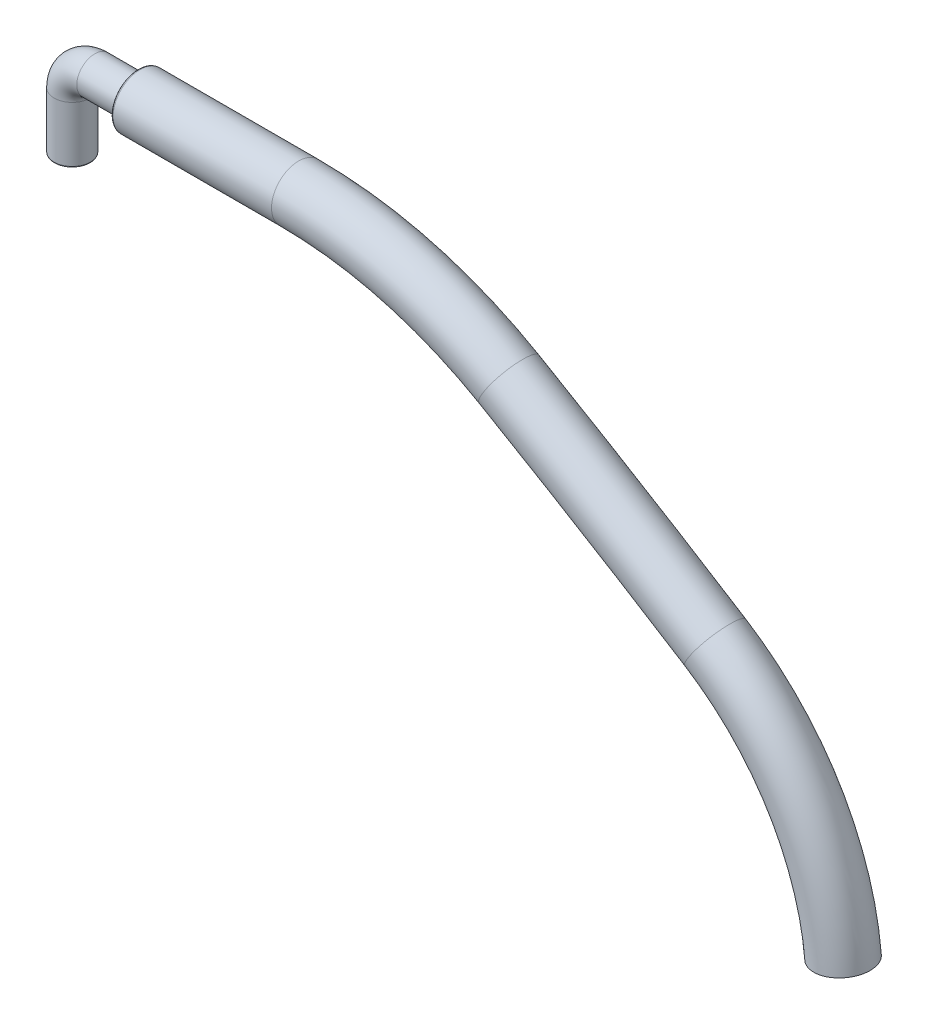
ISO-10303-21;
HEADER;
FILE_DESCRIPTION(('STEP AP214'),'2;1');
FILE_NAME('part.step','',(''),(''),'','','');
FILE_SCHEMA(('AUTOMOTIVE_DESIGN { 1 0 10303 214 1 1 1 1 }'));
ENDSEC;
DATA;
#1=APPLICATION_CONTEXT('core data for automotive mechanical design processes');
#2=APPLICATION_PROTOCOL_DEFINITION('international standard','automotive_design',2000,#1);
#3=PRODUCT_CONTEXT('',#1,'mechanical');
#4=PRODUCT('Part','Part','',(#3));
#5=PRODUCT_RELATED_PRODUCT_CATEGORY('part','',(#4));
#6=PRODUCT_DEFINITION_FORMATION('','',#4);
#7=PRODUCT_DEFINITION_CONTEXT('part definition',#1,'design');
#8=PRODUCT_DEFINITION('design','',#6,#7);
#9=PRODUCT_DEFINITION_SHAPE('','',#8);
#10=(LENGTH_UNIT() NAMED_UNIT(*) SI_UNIT(.MILLI.,.METRE.));
#11=(NAMED_UNIT(*) PLANE_ANGLE_UNIT() SI_UNIT($,.RADIAN.));
#12=(NAMED_UNIT(*) SI_UNIT($,.STERADIAN.) SOLID_ANGLE_UNIT());
#13=UNCERTAINTY_MEASURE_WITH_UNIT(LENGTH_MEASURE(1.E-05),#10,'distance_accuracy_value','');
#14=(GEOMETRIC_REPRESENTATION_CONTEXT(3) GLOBAL_UNCERTAINTY_ASSIGNED_CONTEXT((#13)) GLOBAL_UNIT_ASSIGNED_CONTEXT((#10,
#11,#12)) REPRESENTATION_CONTEXT('',''));
#15=CARTESIAN_POINT('',(0.,0.,0.));
#16=DIRECTION('',(0.,0.,1.));
#17=DIRECTION('',(1.,0.,0.));
#18=AXIS2_PLACEMENT_3D('',#15,#16,#17);
#19=CARTESIAN_POINT('',(218.866247048594,-183.85286055373,0.));
#20=DIRECTION('',(0.,0.,-1.));
#21=DIRECTION('',(-1.,0.,0.));
#22=AXIS2_PLACEMENT_3D('',#19,#20,#21);
#23=TOROIDAL_SURFACE('',#22,122.594141933275,12.);
#24=CARTESIAN_POINT('',(284.383039561643,-80.2339745572182,0.));
#25=DIRECTION('',(0.845218901674018,-0.53442025434387,0.));
#26=DIRECTION('',(0.,0.,-1.));
#27=AXIS2_PLACEMENT_3D('',#24,#25,#26);
#28=CIRCLE('',#27,12.);
#29=CARTESIAN_POINT('',(290.79608261377,-70.09134773713,0.));
#30=VERTEX_POINT('',#29);
#31=EDGE_CURVE('E56',#30,#30,#28,.T.);
#32=CARTESIAN_POINT('',(340.962848699756,-172.819116783204,0.));
#33=DIRECTION('',(0.0900022105177833,-0.995941565606092,0.));
#34=DIRECTION('',(0.,0.,-1.));
#35=AXIS2_PLACEMENT_3D('',#32,#33,#34);
#36=CIRCLE('',#35,12.);
#37=CARTESIAN_POINT('',(352.914147487029,-171.739090256991,0.));
#38=VERTEX_POINT('',#37);
#39=EDGE_CURVE('E52',#38,#38,#36,.T.);
#40=CARTESIAN_POINT('',(218.866247048594,-183.85286055373,0.));
#41=DIRECTION('',(0.,0.,-1.));
#42=DIRECTION('',(-1.,0.,0.));
#43=AXIS2_PLACEMENT_3D('',#40,#41,#42);
#44=CIRCLE('',#43,134.594141933275);
#45=EDGE_CURVE('',#30,#38,#44,.T.);
#46=ORIENTED_EDGE('',*,*,#31,.T.);
#47=ORIENTED_EDGE('',*,*,#39,.F.);
#48=ORIENTED_EDGE('',*,*,#45,.T.);
#49=ORIENTED_EDGE('',*,*,#45,.F.);
#50=EDGE_LOOP('',(#46,#48,#47,#49));
#51=FACE_BOUND('',#50,.T.);
#52=ADVANCED_FACE('F41',(#51),#23,.T.);
#53=CARTESIAN_POINT('',(-1183.22800359876,-2401.35220295904,0.));
#54=DIRECTION('',(0.,0.,-1.));
#55=DIRECTION('',(-1.,0.,0.));
#56=AXIS2_PLACEMENT_3D('',#53,#54,#55);
#57=TOROIDAL_SURFACE('',#56,2746.17406662898,12.);
#58=CARTESIAN_POINT('',(193.106849682031,-24.9737869928195,0.));
#59=DIRECTION('',(0.865341510883649,-0.501182670831309,0.));
#60=DIRECTION('',(0.,0.,-1.));
#61=AXIS2_PLACEMENT_3D('',#58,#59,#60);
#62=CIRCLE('',#61,12.);
#63=CARTESIAN_POINT('',(199.121041732007,-14.5896888622157,0.));
#64=VERTEX_POINT('',#63);
#65=EDGE_CURVE('E61',#64,#64,#62,.T.);
#66=CARTESIAN_POINT('',(-1183.22800359876,-2401.35220295904,0.));
#67=DIRECTION('',(0.,0.,-1.));
#68=DIRECTION('',(-1.,0.,0.));
#69=AXIS2_PLACEMENT_3D('',#66,#67,#68);
#70=CIRCLE('',#69,2758.17406662898);
#71=EDGE_CURVE('',#64,#30,#70,.T.);
#72=ORIENTED_EDGE('',*,*,#65,.T.);
#73=ORIENTED_EDGE('',*,*,#31,.F.);
#74=ORIENTED_EDGE('',*,*,#71,.T.);
#75=ORIENTED_EDGE('',*,*,#71,.F.);
#76=EDGE_LOOP('',(#72,#74,#73,#75));
#77=FACE_BOUND('',#76,.T.);
#78=ADVANCED_FACE('F100',(#77),#57,.T.);
#79=CARTESIAN_POINT('',(100.157423708458,-185.460175267829,0.));
#80=DIRECTION('',(0.,0.,-1.));
#81=DIRECTION('',(-1.,0.,0.));
#82=AXIS2_PLACEMENT_3D('',#79,#80,#81);
#83=TOROIDAL_SURFACE('',#82,185.460175267829,12.);
#84=CARTESIAN_POINT('',(100.157423708458,0.,0.));
#85=DIRECTION('',(1.,0.,0.));
#86=DIRECTION('',(0.,0.,-1.));
#87=AXIS2_PLACEMENT_3D('',#84,#85,#86);
#88=CIRCLE('',#87,12.);
#89=CARTESIAN_POINT('',(100.157423708458,12.,0.));
#90=VERTEX_POINT('',#89);
#91=EDGE_CURVE('E64',#90,#90,#88,.T.);
#92=CARTESIAN_POINT('',(100.157423708458,-185.460175267829,0.));
#93=DIRECTION('',(0.,0.,-1.));
#94=DIRECTION('',(-1.,0.,0.));
#95=AXIS2_PLACEMENT_3D('',#92,#93,#94);
#96=CIRCLE('',#95,197.460175267829);
#97=EDGE_CURVE('',#90,#64,#96,.T.);
#98=ORIENTED_EDGE('',*,*,#91,.T.);
#99=ORIENTED_EDGE('',*,*,#65,.F.);
#100=ORIENTED_EDGE('',*,*,#97,.T.);
#101=ORIENTED_EDGE('',*,*,#97,.F.);
#102=EDGE_LOOP('',(#98,#100,#99,#101));
#103=FACE_BOUND('',#102,.T.);
#104=ADVANCED_FACE('F105',(#103),#83,.T.);
#105=CARTESIAN_POINT('',(100.157423708458,0.,0.));
#106=DIRECTION('',(-1.,0.,0.));
#107=DIRECTION('',(0.,0.,1.));
#108=AXIS2_PLACEMENT_3D('',#105,#106,#107);
#109=CYLINDRICAL_SURFACE('',#108,12.);
#110=CARTESIAN_POINT('',(30.0946378271993,0.,0.));
#111=DIRECTION('',(1.,0.,0.));
#112=DIRECTION('',(0.,0.,-1.));
#113=AXIS2_PLACEMENT_3D('',#110,#111,#112);
#114=CIRCLE('',#113,12.);
#115=CARTESIAN_POINT('',(30.0946378271993,0.,-12.));
#116=VERTEX_POINT('',#115);
#117=EDGE_CURVE('E48',#116,#116,#114,.T.);
#118=ORIENTED_EDGE('',*,*,#117,.T.);
#119=EDGE_LOOP('',(#118));
#120=FACE_BOUND('',#119,.T.);
#121=ORIENTED_EDGE('',*,*,#91,.F.);
#122=EDGE_LOOP('',(#121));
#123=FACE_BOUND('',#122,.T.);
#124=ADVANCED_FACE('F95',(#120,#123),#109,.T.);
#125=CARTESIAN_POINT('',(340.962848699756,-172.819116783204,0.));
#126=DIRECTION('',(0.0900022105177833,-0.995941565606092,0.));
#127=DIRECTION('',(0.,0.,-1.));
#128=AXIS2_PLACEMENT_3D('',#125,#126,#127);
#129=PLANE('',#128);
#130=CARTESIAN_POINT('',(340.962848699756,-172.819116783204,0.));
#131=DIRECTION('',(0.0900022105177833,-0.995941565606092,0.));
#132=DIRECTION('',(0.995941565606092,0.0900022105177833,0.));
#133=AXIS2_PLACEMENT_3D('',#130,#131,#132);
#134=CIRCLE('',#133,8.);
#135=CARTESIAN_POINT('',(348.930381224604,-172.099099099062,0.));
#136=VERTEX_POINT('',#135);
#137=EDGE_CURVE('E67',#136,#136,#134,.T.);
#138=ORIENTED_EDGE('',*,*,#137,.F.);
#139=EDGE_LOOP('',(#138));
#140=FACE_BOUND('',#139,.T.);
#141=ORIENTED_EDGE('',*,*,#39,.T.);
#142=EDGE_LOOP('',(#141));
#143=FACE_BOUND('',#142,.T.);
#144=ADVANCED_FACE('F92',(#140,#143),#129,.T.);
#145=CARTESIAN_POINT('',(29.0946378271993,0.,0.));
#146=DIRECTION('',(1.,0.,0.));
#147=DIRECTION('',(0.,0.,-1.));
#148=AXIS2_PLACEMENT_3D('',#145,#146,#147);
#149=PLANE('',#148);
#150=CARTESIAN_POINT('',(29.0946378271993,0.,0.));
#151=DIRECTION('',(1.,0.,0.));
#152=DIRECTION('',(0.,0.,-1.));
#153=AXIS2_PLACEMENT_3D('',#150,#151,#152);
#154=CIRCLE('',#153,11.);
#155=CARTESIAN_POINT('',(29.0946378271993,0.,-11.));
#156=VERTEX_POINT('',#155);
#157=EDGE_CURVE('E11',#156,#156,#154,.F.);
#158=ORIENTED_EDGE('',*,*,#157,.T.);
#159=EDGE_LOOP('',(#158));
#160=FACE_BOUND('',#159,.T.);
#161=CARTESIAN_POINT('',(29.0946378271993,0.,0.));
#162=DIRECTION('',(1.,0.,0.));
#163=DIRECTION('',(0.,0.,-1.));
#164=AXIS2_PLACEMENT_3D('',#161,#162,#163);
#165=CIRCLE('',#164,8.);
#166=CARTESIAN_POINT('',(29.0946378271993,0.,-8.));
#167=VERTEX_POINT('',#166);
#168=EDGE_CURVE('E68',#167,#167,#165,.T.);
#169=ORIENTED_EDGE('',*,*,#168,.T.);
#170=EDGE_LOOP('',(#169));
#171=FACE_BOUND('',#170,.T.);
#172=ADVANCED_FACE('F88',(#160,#171),#149,.F.);
#173=CARTESIAN_POINT('',(218.866247048594,-183.85286055373,0.));
#174=DIRECTION('',(0.,0.,-1.));
#175=DIRECTION('',(-1.,0.,0.));
#176=AXIS2_PLACEMENT_3D('',#173,#174,#175);
#177=TOROIDAL_SURFACE('',#176,122.594141933275,8.);
#178=CARTESIAN_POINT('',(284.383039561643,-80.2339745572182,0.));
#179=DIRECTION('',(-0.845218901674018,0.534420254343869,0.));
#180=DIRECTION('',(-0.534420254343869,-0.845218901674018,0.));
#181=AXIS2_PLACEMENT_3D('',#178,#179,#180);
#182=CIRCLE('',#181,8.);
#183=CARTESIAN_POINT('',(288.658401596395,-73.472223343826,0.));
#184=VERTEX_POINT('',#183);
#185=EDGE_CURVE('E74',#184,#184,#182,.F.);
#186=CARTESIAN_POINT('',(218.866247048594,-183.85286055373,0.));
#187=DIRECTION('',(0.,0.,-1.));
#188=DIRECTION('',(-1.,0.,0.));
#189=AXIS2_PLACEMENT_3D('',#186,#187,#188);
#190=CIRCLE('',#189,130.594141933275);
#191=EDGE_CURVE('',#184,#136,#190,.T.);
#192=ORIENTED_EDGE('',*,*,#185,.F.);
#193=ORIENTED_EDGE('',*,*,#137,.T.);
#194=ORIENTED_EDGE('',*,*,#191,.T.);
#195=ORIENTED_EDGE('',*,*,#191,.F.);
#196=EDGE_LOOP('',(#192,#194,#193,#195));
#197=FACE_BOUND('',#196,.T.);
#198=ADVANCED_FACE('F85',(#197),#177,.F.);
#199=CARTESIAN_POINT('',(-1183.22800359876,-2401.35220295904,0.));
#200=DIRECTION('',(0.,0.,-1.));
#201=DIRECTION('',(-1.,0.,0.));
#202=AXIS2_PLACEMENT_3D('',#199,#200,#201);
#203=TOROIDAL_SURFACE('',#202,2746.17406662898,8.);
#204=CARTESIAN_POINT('',(193.106849682031,-24.9737869928195,0.));
#205=DIRECTION('',(-0.865341510883649,0.501182670831308,0.));
#206=DIRECTION('',(-0.501182670831308,-0.865341510883649,0.));
#207=AXIS2_PLACEMENT_3D('',#204,#205,#206);
#208=CIRCLE('',#207,8.);
#209=CARTESIAN_POINT('',(197.116311048681,-18.0510549057504,0.));
#210=VERTEX_POINT('',#209);
#211=EDGE_CURVE('E77',#210,#210,#208,.F.);
#212=CARTESIAN_POINT('',(-1183.22800359876,-2401.35220295904,0.));
#213=DIRECTION('',(0.,0.,-1.));
#214=DIRECTION('',(-1.,0.,0.));
#215=AXIS2_PLACEMENT_3D('',#212,#213,#214);
#216=CIRCLE('',#215,2754.17406662898);
#217=EDGE_CURVE('',#210,#184,#216,.T.);
#218=ORIENTED_EDGE('',*,*,#211,.F.);
#219=ORIENTED_EDGE('',*,*,#185,.T.);
#220=ORIENTED_EDGE('',*,*,#217,.T.);
#221=ORIENTED_EDGE('',*,*,#217,.F.);
#222=EDGE_LOOP('',(#218,#220,#219,#221));
#223=FACE_BOUND('',#222,.T.);
#224=ADVANCED_FACE('F83',(#223),#203,.F.);
#225=CARTESIAN_POINT('',(100.157423708458,-185.460175267829,0.));
#226=DIRECTION('',(0.,0.,-1.));
#227=DIRECTION('',(-1.,0.,0.));
#228=AXIS2_PLACEMENT_3D('',#225,#226,#227);
#229=TOROIDAL_SURFACE('',#228,185.460175267829,8.);
#230=CARTESIAN_POINT('',(100.157423708458,0.,0.));
#231=DIRECTION('',(-1.,0.,0.));
#232=DIRECTION('',(0.,-1.,0.));
#233=AXIS2_PLACEMENT_3D('',#230,#231,#232);
#234=CIRCLE('',#233,8.);
#235=CARTESIAN_POINT('',(100.157423708458,7.99999999999998,0.));
#236=VERTEX_POINT('',#235);
#237=EDGE_CURVE('E71',#236,#236,#234,.F.);
#238=CARTESIAN_POINT('',(100.157423708458,-185.460175267829,0.));
#239=DIRECTION('',(0.,0.,-1.));
#240=DIRECTION('',(-1.,0.,0.));
#241=AXIS2_PLACEMENT_3D('',#238,#239,#240);
#242=CIRCLE('',#241,193.460175267829);
#243=EDGE_CURVE('',#236,#210,#242,.T.);
#244=ORIENTED_EDGE('',*,*,#237,.F.);
#245=ORIENTED_EDGE('',*,*,#211,.T.);
#246=ORIENTED_EDGE('',*,*,#243,.T.);
#247=ORIENTED_EDGE('',*,*,#243,.F.);
#248=EDGE_LOOP('',(#244,#246,#245,#247));
#249=FACE_BOUND('',#248,.T.);
#250=ADVANCED_FACE('F119',(#249),#229,.F.);
#251=CARTESIAN_POINT('',(100.157423708458,0.,0.));
#252=DIRECTION('',(-1.,0.,0.));
#253=DIRECTION('',(0.,0.,1.));
#254=AXIS2_PLACEMENT_3D('',#251,#252,#253);
#255=CYLINDRICAL_SURFACE('',#254,8.);
#256=ORIENTED_EDGE('',*,*,#237,.T.);
#257=EDGE_LOOP('',(#256));
#258=FACE_BOUND('',#257,.T.);
#259=ORIENTED_EDGE('',*,*,#168,.F.);
#260=EDGE_LOOP('',(#259));
#261=FACE_BOUND('',#260,.T.);
#262=ADVANCED_FACE('F116',(#258,#261),#255,.F.);
#263=CARTESIAN_POINT('',(30.0946378271993,0.,0.));
#264=DIRECTION('',(1.,0.,0.));
#265=DIRECTION('',(0.,0.,-1.));
#266=AXIS2_PLACEMENT_3D('',#263,#264,#265);
#267=TOROIDAL_SURFACE('',#266,11.,1.);
#268=ORIENTED_EDGE('',*,*,#157,.F.);
#269=EDGE_LOOP('',(#268));
#270=FACE_BOUND('',#269,.T.);
#271=ORIENTED_EDGE('',*,*,#117,.F.);
#272=EDGE_LOOP('',(#271));
#273=FACE_BOUND('',#272,.T.);
#274=ADVANCED_FACE('F43',(#270,#273),#267,.T.);
#275=CLOSED_SHELL('',(#52,#78,#104,#124,#144,#172,#198,#224,#250,#262,#274));
#276=MANIFOLD_SOLID_BREP('B2',#275);
#277=CARTESIAN_POINT('',(10.,0.,0.));
#278=DIRECTION('',(1.,0.,0.));
#279=DIRECTION('',(0.,1.,0.));
#280=AXIS2_PLACEMENT_3D('',#277,#278,#279);
#281=CYLINDRICAL_SURFACE('',#280,8.);
#282=CARTESIAN_POINT('',(49.5,0.,0.));
#283=DIRECTION('',(-1.,0.,0.));
#284=DIRECTION('',(0.,-1.,0.));
#285=AXIS2_PLACEMENT_3D('',#282,#283,#284);
#286=CIRCLE('',#285,8.);
#287=CARTESIAN_POINT('',(49.5,-8.,0.));
#288=VERTEX_POINT('',#287);
#289=EDGE_CURVE('E222',#288,#288,#286,.T.);
#290=ORIENTED_EDGE('',*,*,#289,.T.);
#291=EDGE_LOOP('',(#290));
#292=FACE_BOUND('',#291,.T.);
#293=CARTESIAN_POINT('',(10.,0.,0.));
#294=DIRECTION('',(-1.,0.,0.));
#295=DIRECTION('',(0.,-1.,0.));
#296=AXIS2_PLACEMENT_3D('',#293,#294,#295);
#297=CIRCLE('',#296,8.);
#298=CARTESIAN_POINT('',(10.,8.,0.));
#299=VERTEX_POINT('',#298);
#300=EDGE_CURVE('E239',#299,#299,#297,.T.);
#301=ORIENTED_EDGE('',*,*,#300,.F.);
#302=EDGE_LOOP('',(#301));
#303=FACE_BOUND('',#302,.T.);
#304=ADVANCED_FACE('F207',(#292,#303),#281,.T.);
#305=CARTESIAN_POINT('',(10.,-10.,0.));
#306=DIRECTION('',(0.,0.,-1.));
#307=DIRECTION('',(-1.,0.,0.));
#308=AXIS2_PLACEMENT_3D('',#305,#306,#307);
#309=TOROIDAL_SURFACE('',#308,10.,8.);
#310=CARTESIAN_POINT('',(0.,-10.,0.));
#311=DIRECTION('',(0.,-1.,0.));
#312=DIRECTION('',(1.,0.,0.));
#313=AXIS2_PLACEMENT_3D('',#310,#311,#312);
#314=CIRCLE('',#313,8.);
#315=CARTESIAN_POINT('',(-8.,-10.,0.));
#316=VERTEX_POINT('',#315);
#317=EDGE_CURVE('E242',#316,#316,#314,.T.);
#318=CARTESIAN_POINT('',(10.,-10.,0.));
#319=DIRECTION('',(0.,0.,-1.));
#320=DIRECTION('',(-1.,0.,0.));
#321=AXIS2_PLACEMENT_3D('',#318,#319,#320);
#322=CIRCLE('',#321,18.);
#323=EDGE_CURVE('',#316,#299,#322,.T.);
#324=ORIENTED_EDGE('',*,*,#317,.F.);
#325=ORIENTED_EDGE('',*,*,#300,.T.);
#326=ORIENTED_EDGE('',*,*,#323,.T.);
#327=ORIENTED_EDGE('',*,*,#323,.F.);
#328=EDGE_LOOP('',(#324,#326,#325,#327));
#329=FACE_BOUND('',#328,.T.);
#330=ADVANCED_FACE('F269',(#329),#309,.T.);
#331=CARTESIAN_POINT('',(0.,-10.,0.));
#332=DIRECTION('',(0.,-1.,0.));
#333=DIRECTION('',(1.,0.,0.));
#334=AXIS2_PLACEMENT_3D('',#331,#332,#333);
#335=CYLINDRICAL_SURFACE('',#334,8.);
#336=CARTESIAN_POINT('',(0.,-34.5,0.));
#337=DIRECTION('',(0.,-1.,0.));
#338=DIRECTION('',(1.,0.,0.));
#339=AXIS2_PLACEMENT_3D('',#336,#337,#338);
#340=CIRCLE('',#339,8.);
#341=CARTESIAN_POINT('',(8.,-34.5,0.));
#342=VERTEX_POINT('',#341);
#343=EDGE_CURVE('E227',#342,#342,#340,.F.);
#344=ORIENTED_EDGE('',*,*,#343,.T.);
#345=EDGE_LOOP('',(#344));
#346=FACE_BOUND('',#345,.T.);
#347=ORIENTED_EDGE('',*,*,#317,.T.);
#348=EDGE_LOOP('',(#347));
#349=FACE_BOUND('',#348,.T.);
#350=ADVANCED_FACE('F275',(#346,#349),#335,.T.);
#351=CARTESIAN_POINT('',(50.,0.,0.));
#352=DIRECTION('',(-1.,0.,0.));
#353=DIRECTION('',(0.,-1.,0.));
#354=AXIS2_PLACEMENT_3D('',#351,#352,#353);
#355=PLANE('',#354);
#356=CARTESIAN_POINT('',(50.,0.,0.));
#357=DIRECTION('',(-1.,0.,0.));
#358=DIRECTION('',(0.,-1.,0.));
#359=AXIS2_PLACEMENT_3D('',#356,#357,#358);
#360=CIRCLE('',#359,7.5);
#361=CARTESIAN_POINT('',(50.,-7.5,0.));
#362=VERTEX_POINT('',#361);
#363=EDGE_CURVE('E214',#362,#362,#360,.F.);
#364=ORIENTED_EDGE('',*,*,#363,.T.);
#365=EDGE_LOOP('',(#364));
#366=FACE_BOUND('',#365,.T.);
#367=CARTESIAN_POINT('',(50.,0.,0.));
#368=DIRECTION('',(-1.,0.,0.));
#369=DIRECTION('',(0.,-1.,0.));
#370=AXIS2_PLACEMENT_3D('',#367,#368,#369);
#371=CIRCLE('',#370,6.5);
#372=CARTESIAN_POINT('',(50.,-6.5,0.));
#373=VERTEX_POINT('',#372);
#374=EDGE_CURVE('E218',#373,#373,#371,.T.);
#375=ORIENTED_EDGE('',*,*,#374,.T.);
#376=EDGE_LOOP('',(#375));
#377=FACE_BOUND('',#376,.T.);
#378=ADVANCED_FACE('F301',(#366,#377),#355,.F.);
#379=CARTESIAN_POINT('',(0.,-35.,0.));
#380=DIRECTION('',(0.,-1.,0.));
#381=DIRECTION('',(1.,0.,0.));
#382=AXIS2_PLACEMENT_3D('',#379,#380,#381);
#383=PLANE('',#382);
#384=CARTESIAN_POINT('',(0.,-35.,0.));
#385=DIRECTION('',(0.,-1.,0.));
#386=DIRECTION('',(1.,0.,0.));
#387=AXIS2_PLACEMENT_3D('',#384,#385,#386);
#388=CIRCLE('',#387,6.5);
#389=CARTESIAN_POINT('',(6.5,-35.,0.));
#390=VERTEX_POINT('',#389);
#391=EDGE_CURVE('E230',#390,#390,#388,.F.);
#392=ORIENTED_EDGE('',*,*,#391,.T.);
#393=EDGE_LOOP('',(#392));
#394=FACE_BOUND('',#393,.T.);
#395=CARTESIAN_POINT('',(0.,-35.,0.));
#396=DIRECTION('',(0.,-1.,0.));
#397=DIRECTION('',(1.,0.,0.));
#398=AXIS2_PLACEMENT_3D('',#395,#396,#397);
#399=CIRCLE('',#398,7.5);
#400=CARTESIAN_POINT('',(7.5,-35.,0.));
#401=VERTEX_POINT('',#400);
#402=EDGE_CURVE('E233',#401,#401,#399,.T.);
#403=ORIENTED_EDGE('',*,*,#402,.T.);
#404=EDGE_LOOP('',(#403));
#405=FACE_BOUND('',#404,.T.);
#406=ADVANCED_FACE('F266',(#394,#405),#383,.T.);
#407=CARTESIAN_POINT('',(10.,0.,0.));
#408=DIRECTION('',(1.,0.,0.));
#409=DIRECTION('',(0.,1.,0.));
#410=AXIS2_PLACEMENT_3D('',#407,#408,#409);
#411=CYLINDRICAL_SURFACE('',#410,6.);
#412=CARTESIAN_POINT('',(49.5,0.,0.));
#413=DIRECTION('',(-1.,0.,0.));
#414=DIRECTION('',(0.,-1.,0.));
#415=AXIS2_PLACEMENT_3D('',#412,#413,#414);
#416=CIRCLE('',#415,6.);
#417=CARTESIAN_POINT('',(49.5,-6.,0.));
#418=VERTEX_POINT('',#417);
#419=EDGE_CURVE('E40',#418,#418,#416,.F.);
#420=ORIENTED_EDGE('',*,*,#419,.T.);
#421=EDGE_LOOP('',(#420));
#422=FACE_BOUND('',#421,.T.);
#423=CARTESIAN_POINT('',(10.,0.,0.));
#424=DIRECTION('',(-1.,0.,0.));
#425=DIRECTION('',(0.,-1.,0.));
#426=AXIS2_PLACEMENT_3D('',#423,#424,#425);
#427=CIRCLE('',#426,6.);
#428=CARTESIAN_POINT('',(10.,6.,0.));
#429=VERTEX_POINT('',#428);
#430=EDGE_CURVE('E245',#429,#429,#427,.T.);
#431=ORIENTED_EDGE('',*,*,#430,.T.);
#432=EDGE_LOOP('',(#431));
#433=FACE_BOUND('',#432,.T.);
#434=ADVANCED_FACE('F252',(#422,#433),#411,.F.);
#435=CARTESIAN_POINT('',(10.,-10.,0.));
#436=DIRECTION('',(0.,0.,-1.));
#437=DIRECTION('',(-1.,0.,0.));
#438=AXIS2_PLACEMENT_3D('',#435,#436,#437);
#439=TOROIDAL_SURFACE('',#438,10.,6.);
#440=CARTESIAN_POINT('',(0.,-10.,0.));
#441=DIRECTION('',(0.,-1.,0.));
#442=DIRECTION('',(1.,0.,0.));
#443=AXIS2_PLACEMENT_3D('',#440,#441,#442);
#444=CIRCLE('',#443,6.);
#445=CARTESIAN_POINT('',(-6.,-10.,0.));
#446=VERTEX_POINT('',#445);
#447=EDGE_CURVE('E246',#446,#446,#444,.T.);
#448=CARTESIAN_POINT('',(10.,-10.,0.));
#449=DIRECTION('',(0.,0.,-1.));
#450=DIRECTION('',(-1.,0.,0.));
#451=AXIS2_PLACEMENT_3D('',#448,#449,#450);
#452=CIRCLE('',#451,16.);
#453=EDGE_CURVE('',#446,#429,#452,.T.);
#454=ORIENTED_EDGE('',*,*,#447,.T.);
#455=ORIENTED_EDGE('',*,*,#430,.F.);
#456=ORIENTED_EDGE('',*,*,#453,.T.);
#457=ORIENTED_EDGE('',*,*,#453,.F.);
#458=EDGE_LOOP('',(#454,#456,#455,#457));
#459=FACE_BOUND('',#458,.T.);
#460=ADVANCED_FACE('F254',(#459),#439,.F.);
#461=CARTESIAN_POINT('',(0.,-10.,0.));
#462=DIRECTION('',(0.,-1.,0.));
#463=DIRECTION('',(1.,0.,0.));
#464=AXIS2_PLACEMENT_3D('',#461,#462,#463);
#465=CYLINDRICAL_SURFACE('',#464,6.);
#466=CARTESIAN_POINT('',(0.,-34.5,0.));
#467=DIRECTION('',(0.,-1.,0.));
#468=DIRECTION('',(1.,0.,0.));
#469=AXIS2_PLACEMENT_3D('',#466,#467,#468);
#470=CIRCLE('',#469,6.);
#471=CARTESIAN_POINT('',(6.,-34.5,0.));
#472=VERTEX_POINT('',#471);
#473=EDGE_CURVE('E236',#472,#472,#470,.T.);
#474=ORIENTED_EDGE('',*,*,#473,.T.);
#475=EDGE_LOOP('',(#474));
#476=FACE_BOUND('',#475,.T.);
#477=ORIENTED_EDGE('',*,*,#447,.F.);
#478=EDGE_LOOP('',(#477));
#479=FACE_BOUND('',#478,.T.);
#480=ADVANCED_FACE('F256',(#476,#479),#465,.F.);
#481=CARTESIAN_POINT('',(0.,-34.5,0.));
#482=DIRECTION('',(0.,-1.,0.));
#483=DIRECTION('',(1.,0.,0.));
#484=AXIS2_PLACEMENT_3D('',#481,#482,#483);
#485=TOROIDAL_SURFACE('',#484,6.5,0.5);
#486=ORIENTED_EDGE('',*,*,#391,.F.);
#487=EDGE_LOOP('',(#486));
#488=FACE_BOUND('',#487,.T.);
#489=ORIENTED_EDGE('',*,*,#473,.F.);
#490=EDGE_LOOP('',(#489));
#491=FACE_BOUND('',#490,.T.);
#492=ADVANCED_FACE('F263',(#488,#491),#485,.T.);
#493=CARTESIAN_POINT('',(0.,-34.5,0.));
#494=DIRECTION('',(0.,-1.,0.));
#495=DIRECTION('',(1.,0.,0.));
#496=AXIS2_PLACEMENT_3D('',#493,#494,#495);
#497=TOROIDAL_SURFACE('',#496,7.5,0.5);
#498=ORIENTED_EDGE('',*,*,#343,.F.);
#499=EDGE_LOOP('',(#498));
#500=FACE_BOUND('',#499,.T.);
#501=ORIENTED_EDGE('',*,*,#402,.F.);
#502=EDGE_LOOP('',(#501));
#503=FACE_BOUND('',#502,.T.);
#504=ADVANCED_FACE('F283',(#500,#503),#497,.T.);
#505=CARTESIAN_POINT('',(49.5,0.,0.));
#506=DIRECTION('',(-1.,0.,0.));
#507=DIRECTION('',(0.,-1.,0.));
#508=AXIS2_PLACEMENT_3D('',#505,#506,#507);
#509=TOROIDAL_SURFACE('',#508,7.5,0.5);
#510=ORIENTED_EDGE('',*,*,#363,.F.);
#511=EDGE_LOOP('',(#510));
#512=FACE_BOUND('',#511,.T.);
#513=ORIENTED_EDGE('',*,*,#289,.F.);
#514=EDGE_LOOP('',(#513));
#515=FACE_BOUND('',#514,.T.);
#516=ADVANCED_FACE('F286',(#512,#515),#509,.T.);
#517=CARTESIAN_POINT('',(49.5,0.,0.));
#518=DIRECTION('',(-1.,0.,0.));
#519=DIRECTION('',(0.,-1.,0.));
#520=AXIS2_PLACEMENT_3D('',#517,#518,#519);
#521=TOROIDAL_SURFACE('',#520,6.5,0.5);
#522=ORIENTED_EDGE('',*,*,#419,.F.);
#523=EDGE_LOOP('',(#522));
#524=FACE_BOUND('',#523,.T.);
#525=ORIENTED_EDGE('',*,*,#374,.F.);
#526=EDGE_LOOP('',(#525));
#527=FACE_BOUND('',#526,.T.);
#528=ADVANCED_FACE('F209',(#524,#527),#521,.T.);
#529=CLOSED_SHELL('',(#304,#330,#350,#378,#406,#434,#460,#480,#492,#504,#516,#528));
#530=MANIFOLD_SOLID_BREP('B6',#529);
#531=ADVANCED_BREP_SHAPE_REPRESENTATION('',(#18,#276,#530),#14);
#532=SHAPE_DEFINITION_REPRESENTATION(#9,#531);
ENDSEC;
END-ISO-10303-21;
